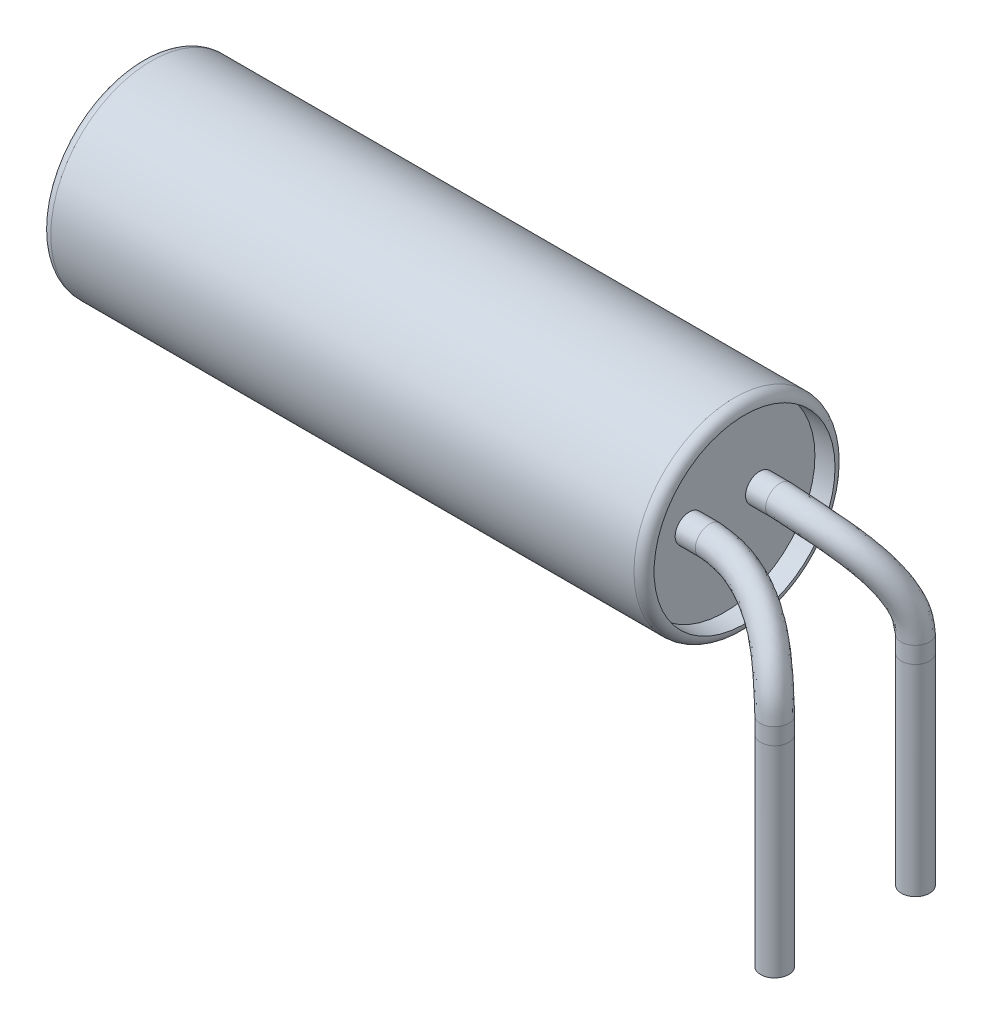
ISO-10303-21;
HEADER;
FILE_DESCRIPTION(('STEP AP214'),'2;1');
FILE_NAME('part.step','',(''),(''),'','','');
FILE_SCHEMA(('AUTOMOTIVE_DESIGN { 1 0 10303 214 1 1 1 1 }'));
ENDSEC;
DATA;
#1=APPLICATION_CONTEXT('core data for automotive mechanical design processes');
#2=APPLICATION_PROTOCOL_DEFINITION('international standard','automotive_design',2000,#1);
#3=PRODUCT_CONTEXT('',#1,'mechanical');
#4=PRODUCT('Part','Part','',(#3));
#5=PRODUCT_RELATED_PRODUCT_CATEGORY('part','',(#4));
#6=PRODUCT_DEFINITION_FORMATION('','',#4);
#7=PRODUCT_DEFINITION_CONTEXT('part definition',#1,'design');
#8=PRODUCT_DEFINITION('design','',#6,#7);
#9=PRODUCT_DEFINITION_SHAPE('','',#8);
#10=(LENGTH_UNIT() NAMED_UNIT(*) SI_UNIT(.MILLI.,.METRE.));
#11=(NAMED_UNIT(*) PLANE_ANGLE_UNIT() SI_UNIT($,.RADIAN.));
#12=(NAMED_UNIT(*) SI_UNIT($,.STERADIAN.) SOLID_ANGLE_UNIT());
#13=UNCERTAINTY_MEASURE_WITH_UNIT(LENGTH_MEASURE(1.E-05),#10,'distance_accuracy_value','');
#14=(GEOMETRIC_REPRESENTATION_CONTEXT(3) GLOBAL_UNCERTAINTY_ASSIGNED_CONTEXT((#13)) GLOBAL_UNIT_ASSIGNED_CONTEXT((#10,
#11,#12)) REPRESENTATION_CONTEXT('',''));
#15=CARTESIAN_POINT('',(0.,0.,0.));
#16=DIRECTION('',(0.,0.,1.));
#17=DIRECTION('',(1.,0.,0.));
#18=AXIS2_PLACEMENT_3D('',#15,#16,#17);
#19=CARTESIAN_POINT('',(0.984259932692,-3.,0.839112365666));
#20=DIRECTION('',(0.,1.,0.));
#21=DIRECTION('',(0.,0.,1.));
#22=AXIS2_PLACEMENT_3D('',#19,#20,#21);
#23=PLANE('',#22);
#24=CARTESIAN_POINT('',(1.,-3.,0.7));
#25=DIRECTION('',(0.,-1.,0.));
#26=DIRECTION('',(0.,0.,-1.));
#27=AXIS2_PLACEMENT_3D('',#24,#25,#26);
#28=CIRCLE('',#27,0.14);
#29=CARTESIAN_POINT('',(1.,-3.,0.56));
#30=VERTEX_POINT('',#29);
#31=EDGE_CURVE('E166',#30,#30,#28,.F.);
#32=ORIENTED_EDGE('',*,*,#31,.F.);
#33=EDGE_LOOP('',(#32));
#34=FACE_BOUND('',#33,.T.);
#35=ADVANCED_FACE('F24',(#34),#23,.F.);
#36=CARTESIAN_POINT('',(0.984259932692,-3.,-0.839112365666));
#37=DIRECTION('',(0.,-1.,0.));
#38=DIRECTION('',(0.,0.,-1.));
#39=AXIS2_PLACEMENT_3D('',#36,#37,#38);
#40=PLANE('',#39);
#41=CARTESIAN_POINT('',(1.,-3.,-0.7));
#42=DIRECTION('',(0.,-1.,0.));
#43=DIRECTION('',(0.,0.,-1.));
#44=AXIS2_PLACEMENT_3D('',#41,#42,#43);
#45=CIRCLE('',#44,0.14);
#46=CARTESIAN_POINT('',(1.,-3.,-0.84));
#47=VERTEX_POINT('',#46);
#48=EDGE_CURVE('E153',#47,#47,#45,.F.);
#49=ORIENTED_EDGE('',*,*,#48,.F.);
#50=EDGE_LOOP('',(#49));
#51=FACE_BOUND('',#50,.T.);
#52=ADVANCED_FACE('F348',(#51),#40,.T.);
#53=CARTESIAN_POINT('',(1.,-1.,0.7));
#54=DIRECTION('',(0.,-1.,0.));
#55=DIRECTION('',(0.,0.,-1.));
#56=AXIS2_PLACEMENT_3D('',#53,#54,#55);
#57=CYLINDRICAL_SURFACE('',#56,0.14);
#58=ORIENTED_EDGE('',*,*,#31,.T.);
#59=EDGE_LOOP('',(#58));
#60=FACE_BOUND('',#59,.T.);
#61=CARTESIAN_POINT('',(1.,-1.,0.7));
#62=DIRECTION('',(0.,1.,0.));
#63=DIRECTION('',(0.,0.,1.));
#64=AXIS2_PLACEMENT_3D('',#61,#62,#63);
#65=CIRCLE('',#64,0.140000000000183);
#66=CARTESIAN_POINT('',(1.,-1.,0.840000000000183));
#67=VERTEX_POINT('',#66);
#68=EDGE_CURVE('E81',#67,#67,#65,.T.);
#69=ORIENTED_EDGE('',*,*,#68,.F.);
#70=EDGE_LOOP('',(#69));
#71=FACE_BOUND('',#70,.T.);
#72=ADVANCED_FACE('F339',(#60,#71),#57,.T.);
#73=CARTESIAN_POINT('',(1.,-1.,-0.7));
#74=DIRECTION('',(0.,-1.,0.));
#75=DIRECTION('',(0.,0.,-1.));
#76=AXIS2_PLACEMENT_3D('',#73,#74,#75);
#77=CYLINDRICAL_SURFACE('',#76,0.14);
#78=ORIENTED_EDGE('',*,*,#48,.T.);
#79=EDGE_LOOP('',(#78));
#80=FACE_BOUND('',#79,.T.);
#81=CARTESIAN_POINT('',(1.,-1.,-0.7));
#82=DIRECTION('',(0.,-1.,0.));
#83=DIRECTION('',(0.,0.,-1.));
#84=AXIS2_PLACEMENT_3D('',#81,#82,#83);
#85=CIRCLE('',#84,0.140000000000183);
#86=CARTESIAN_POINT('',(1.,-1.,-0.840000000000183));
#87=VERTEX_POINT('',#86);
#88=EDGE_CURVE('E144',#87,#87,#85,.T.);
#89=ORIENTED_EDGE('',*,*,#88,.T.);
#90=EDGE_LOOP('',(#89));
#91=FACE_BOUND('',#90,.T.);
#92=ADVANCED_FACE('F337',(#80,#91),#77,.T.);
#93=CARTESIAN_POINT('',(1.015740067308,-0.836117983914,0.560887634334));
#94=CARTESIAN_POINT('',(1.015740067308,-1.,0.560887634334));
#95=CARTESIAN_POINT('',(1.29396479864,-0.830753280627,0.59236776895));
#96=CARTESIAN_POINT('',(1.29396479864,-1.,0.59236776895));
#97=CARTESIAN_POINT('',(1.262484664024,-0.833136319422,0.870592500282));
#98=CARTESIAN_POINT('',(1.262484664024,-1.,0.870592500282));
#99=CARTESIAN_POINT('',(0.984259932692,-0.838501022708,0.839112365666));
#100=CARTESIAN_POINT('',(0.984259932692,-1.,0.839112365666));
#101=CARTESIAN_POINT('',(0.70603520136,-0.843865725994,0.80763223105));
#102=CARTESIAN_POINT('',(0.70603520136,-1.,0.80763223105));
#103=CARTESIAN_POINT('',(0.737515335976,-0.8414826872,0.529407499718));
#104=CARTESIAN_POINT('',(0.737515335976,-1.,0.529407499718));
#105=CARTESIAN_POINT('',(1.015740067308,-0.836117983914,0.560887634334));
#106=CARTESIAN_POINT('',(1.015740067308,-1.,0.560887634334));
#107=(BOUNDED_SURFACE() B_SPLINE_SURFACE(3,1,((#93,#94),(#95,#96),(#97,#98),(#99,#100),(#101,
#102),(#103,#104),(#105,#106)),.UNSPECIFIED.,.T.,.F.,.F.) B_SPLINE_SURFACE_WITH_KNOTS((4,3,4),
(2,2),(0.,0.5,1.),(0.,1.),
.UNSPECIFIED.) GEOMETRIC_REPRESENTATION_ITEM() RATIONAL_B_SPLINE_SURFACE(((1.,1.),
(0.333333333333,0.333333333333),(0.333333333333,0.333333333333),(1.,1.),(0.333333333333,
0.333333333333),(0.333333333333,0.333333333333),(1.,1.))) REPRESENTATION_ITEM('') SURFACE());
#108=CARTESIAN_POINT('',(1.015740067308,-0.836117983914,0.560887634334));
#109=CARTESIAN_POINT('',(0.737515335976,-0.8414826872,0.529407499718));
#110=CARTESIAN_POINT('',(0.70603520136,-0.843865725994,0.80763223105));
#111=CARTESIAN_POINT('',(0.984259932692,-0.838501022708,0.839112365666));
#112=CARTESIAN_POINT('',(1.262484664024,-0.833136319422,0.870592500282));
#113=CARTESIAN_POINT('',(1.29396479864,-0.830753280627,0.59236776895));
#114=CARTESIAN_POINT('',(1.015740067308,-0.836117983914,0.560887634334));
#115=(BOUNDED_CURVE() B_SPLINE_CURVE(3,(#108,#109,#110,#111,#112,#113,#114),.UNSPECIFIED.,.T.,
.F.) B_SPLINE_CURVE_WITH_KNOTS((4,3,4),(0.,0.5,1.),
.UNSPECIFIED.) CURVE() GEOMETRIC_REPRESENTATION_ITEM() RATIONAL_B_SPLINE_CURVE((1.,
0.333333333333,0.333333333333,1.,0.333333333333,0.333333333333,1.)) REPRESENTATION_ITEM(''));
#116=CARTESIAN_POINT('',(1.015740067308,-0.836117983914,0.560887634334));
#117=VERTEX_POINT('',#116);
#118=EDGE_CURVE('E133',#117,#117,#115,.F.);
#119=ORIENTED_EDGE('',*,*,#68,.T.);
#120=EDGE_LOOP('',(#119));
#121=FACE_BOUND('',#120,.T.);
#122=ORIENTED_EDGE('',*,*,#118,.T.);
#123=EDGE_LOOP('',(#122));
#124=FACE_BOUND('',#123,.T.);
#125=ADVANCED_FACE('F334',(#121,#124),#107,.T.);
#126=CARTESIAN_POINT('',(1.015740067308,-0.836117983914,-0.560887634334));
#127=CARTESIAN_POINT('',(1.015740067308,-1.,-0.560887634334));
#128=CARTESIAN_POINT('',(1.29396479864,-0.830753280627,-0.59236776895));
#129=CARTESIAN_POINT('',(1.29396479864,-1.,-0.59236776895));
#130=CARTESIAN_POINT('',(1.262484664024,-0.833136319422,-0.870592500282));
#131=CARTESIAN_POINT('',(1.262484664024,-1.,-0.870592500282));
#132=CARTESIAN_POINT('',(0.984259932692,-0.838501022708,-0.839112365666));
#133=CARTESIAN_POINT('',(0.984259932692,-1.,-0.839112365666));
#134=CARTESIAN_POINT('',(0.70603520136,-0.843865725994,-0.80763223105));
#135=CARTESIAN_POINT('',(0.70603520136,-1.,-0.80763223105));
#136=CARTESIAN_POINT('',(0.737515335976,-0.8414826872,-0.529407499718));
#137=CARTESIAN_POINT('',(0.737515335976,-1.,-0.529407499718));
#138=CARTESIAN_POINT('',(1.015740067308,-0.836117983914,-0.560887634334));
#139=CARTESIAN_POINT('',(1.015740067308,-1.,-0.560887634334));
#140=(BOUNDED_SURFACE() B_SPLINE_SURFACE(3,1,((#126,#127),(#128,#129),(#130,#131),(#132,#133),
(#134,#135),(#136,#137),(#138,#139)),.UNSPECIFIED.,.T.,.F.,.F.) B_SPLINE_SURFACE_WITH_KNOTS((4,
3,4),(2,2),(0.,0.5,1.),(0.,1.),
.UNSPECIFIED.) GEOMETRIC_REPRESENTATION_ITEM() RATIONAL_B_SPLINE_SURFACE(((1.,1.),
(0.333333333333,0.333333333333),(0.333333333333,0.333333333333),(1.,1.),(0.333333333333,
0.333333333333),(0.333333333333,0.333333333333),(1.,1.))) REPRESENTATION_ITEM('') SURFACE());
#141=CARTESIAN_POINT('',(1.015740067308,-0.836117983914,-0.560887634334));
#142=CARTESIAN_POINT('',(0.737515335976,-0.8414826872,-0.529407499718));
#143=CARTESIAN_POINT('',(0.70603520136,-0.843865725994,-0.80763223105));
#144=CARTESIAN_POINT('',(0.984259932692,-0.838501022708,-0.839112365666));
#145=CARTESIAN_POINT('',(1.262484664024,-0.833136319422,-0.870592500282));
#146=CARTESIAN_POINT('',(1.29396479864,-0.830753280627,-0.59236776895));
#147=CARTESIAN_POINT('',(1.015740067308,-0.836117983914,-0.560887634334));
#148=(BOUNDED_CURVE() B_SPLINE_CURVE(3,(#141,#142,#143,#144,#145,#146,#147),.UNSPECIFIED.,.T.,
.F.) B_SPLINE_CURVE_WITH_KNOTS((4,3,4),(0.,0.5,1.),
.UNSPECIFIED.) CURVE() GEOMETRIC_REPRESENTATION_ITEM() RATIONAL_B_SPLINE_CURVE((1.,
0.333333333333,0.333333333333,1.,0.333333333333,0.333333333333,1.)) REPRESENTATION_ITEM(''));
#149=CARTESIAN_POINT('',(1.015740067308,-0.836117983914,-0.560887634334));
#150=VERTEX_POINT('',#149);
#151=EDGE_CURVE('E143',#150,#150,#148,.F.);
#152=ORIENTED_EDGE('',*,*,#151,.F.);
#153=EDGE_LOOP('',(#152));
#154=FACE_BOUND('',#153,.T.);
#155=ORIENTED_EDGE('',*,*,#88,.F.);
#156=EDGE_LOOP('',(#155));
#157=FACE_BOUND('',#156,.T.);
#158=ADVANCED_FACE('F108',(#154,#157),#140,.F.);
#159=CARTESIAN_POINT('',(-0.004086019351866,-0.139807884508,0.342668190572));
#160=CARTESIAN_POINT('',(0.05819825144663,-0.145525224415,0.341603108665));
#161=CARTESIAN_POINT('',(0.17788976835,-0.156512221249,0.339556343608));
#162=CARTESIAN_POINT('',(0.338471592077,-0.196879700007,0.356045557664));
#163=CARTESIAN_POINT('',(0.476756786135,-0.24773201586,0.378389397387));
#164=CARTESIAN_POINT('',(0.599908520349,-0.307654935133,0.40448620936));
#165=CARTESIAN_POINT('',(0.714729572021,-0.377846023481,0.435188476897));
#166=CARTESIAN_POINT('',(0.822321102422,-0.464105061271,0.473298903905));
#167=CARTESIAN_POINT('',(0.914509937698,-0.570567597818,0.514596653534));
#168=CARTESIAN_POINT('',(0.984985485343,-0.695886247708,0.551949989724));
#169=CARTESIAN_POINT('',(1.005615909484,-0.78995483883,0.557945434544));
#170=CARTESIAN_POINT('',(1.015740067308,-0.836117983914,0.560887634334));
#171=CARTESIAN_POINT('',(-0.004086019351866,-0.154471503363,0.622283959587));
#172=CARTESIAN_POINT('',(0.05693907429329,-0.166815766671,0.621187107161));
#173=CARTESIAN_POINT('',(0.174210833823,-0.19053770451,0.61907928878));
#174=CARTESIAN_POINT('',(0.317747533271,-0.260920510606,0.635470090962));
#175=CARTESIAN_POINT('',(0.420233943328,-0.343560783099,0.648374270391));
#176=CARTESIAN_POINT('',(0.48604972466,-0.426603766097,0.644805695956));
#177=CARTESIAN_POINT('',(0.533224419481,-0.499034205378,0.620861114569));
#178=CARTESIAN_POINT('',(0.583810128099,-0.564933586169,0.589662755636));
#179=CARTESIAN_POINT('',(0.64346722846,-0.63843801051,0.565678306959));
#180=CARTESIAN_POINT('',(0.703983705624,-0.729294814321,0.552921647954));
#181=CARTESIAN_POINT('',(0.726476996448,-0.804551353449,0.537148165746));
#182=CARTESIAN_POINT('',(0.737515335976,-0.8414826872,0.529407499718));
#183=CARTESIAN_POINT('',(0.004086019351866,0.125144265652,0.636947578443));
#184=CARTESIAN_POINT('',(0.07911078540651,0.111399457469,0.642292291019));
#185=CARTESIAN_POINT('',(0.223285678028,0.08498609627955,0.652563210907));
#186=CARTESIAN_POINT('',(0.416677597022,-0.004586846011312,0.705607086775));
#187=CARTESIAN_POINT('',(0.564730364908,-0.124656906383,0.771027268937));
#188=CARTESIAN_POINT('',(0.657001161997,-0.264296546034,0.831105295757));
#189=CARTESIAN_POINT('',(0.69580365222,-0.401107292923,0.865182689189));
#190=CARTESIAN_POINT('',(0.703694123419,-0.521377423657,0.869507810704));
#191=CARTESIAN_POINT('',(0.704665617767,-0.628124077423,0.855604675921));
#192=CARTESIAN_POINT('',(0.708865294625,-0.732480695681,0.836712682121));
#193=CARTESIAN_POINT('',(0.706966845006,-0.807198681475,0.817205278622));
#194=CARTESIAN_POINT('',(0.70603520136,-0.843865725994,0.80763223105));
#195=CARTESIAN_POINT('',(0.004086019351866,0.139807884508,0.357331809428));
#196=CARTESIAN_POINT('',(0.08036996255985,0.132689999725,0.362708292524));
#197=CARTESIAN_POINT('',(0.226964612555,0.119011579541,0.373040265735));
#198=CARTESIAN_POINT('',(0.437401655827,0.05945396458789,0.426182553477));
#199=CARTESIAN_POINT('',(0.621253207716,-0.02882813914385,0.501042395934));
#200=CARTESIAN_POINT('',(0.770859957686,-0.14534771507,0.59078580916));
#201=CARTESIAN_POINT('',(0.87730880476,-0.279919111027,0.679510051517));
#202=CARTESIAN_POINT('',(0.942205097741,-0.42054889876,0.753143958973));
#203=CARTESIAN_POINT('',(0.975708327005,-0.560253664732,0.804523022496));
#204=CARTESIAN_POINT('',(0.989867074345,-0.699072129067,0.835741023892));
#205=CARTESIAN_POINT('',(0.986105758042,-0.792602166856,0.83800254742));
#206=CARTESIAN_POINT('',(0.984259932692,-0.838501022708,0.839112365666));
#207=CARTESIAN_POINT('',(0.004086019351866,0.154471503363,0.07771604041254));
#208=CARTESIAN_POINT('',(0.08162913971319,0.153980541981,0.0831242940287));
#209=CARTESIAN_POINT('',(0.230643547082,0.153037062802,0.09351732056359));
#210=CARTESIAN_POINT('',(0.458125714632,0.123494775187,0.146758020179));
#211=CARTESIAN_POINT('',(0.677776050524,0.06700062809576,0.23105752293));
#212=CARTESIAN_POINT('',(0.884718753376,-0.02639888410568,0.350466322564));
#213=CARTESIAN_POINT('',(1.0588139573,-0.15873092913,0.493837413846));
#214=CARTESIAN_POINT('',(1.180716072064,-0.319720373862,0.636780107242));
#215=CARTESIAN_POINT('',(1.246751036242,-0.49238325204,0.75344136907));
#216=CARTESIAN_POINT('',(1.270868854064,-0.665663562454,0.834769365663));
#217=CARTESIAN_POINT('',(1.265244671078,-0.778005652237,0.858799816218));
#218=CARTESIAN_POINT('',(1.262484664024,-0.833136319422,0.870592500282));
#219=CARTESIAN_POINT('',(-0.004086019351866,-0.125144265652,0.06305242155674));
#220=CARTESIAN_POINT('',(0.05945742859996,-0.124234682159,0.06201911016995));
#221=CARTESIAN_POINT('',(0.181568702877,-0.122486737988,0.06003339843675));
#222=CARTESIAN_POINT('',(0.359195650882,-0.132838889407,0.07662102436548));
#223=CARTESIAN_POINT('',(0.533279628943,-0.15190324862,0.108404524384));
#224=CARTESIAN_POINT('',(0.713767316039,-0.188706104169,0.164166722764));
#225=CARTESIAN_POINT('',(0.896234724561,-0.256657841585,0.249515839225));
#226=CARTESIAN_POINT('',(1.060832076744,-0.363276536374,0.356935052174));
#227=CARTESIAN_POINT('',(1.185552646935,-0.502697185127,0.463515000109));
#228=CARTESIAN_POINT('',(1.265987265062,-0.662477681095,0.550978331495));
#229=CARTESIAN_POINT('',(1.28475482252,-0.775358324211,0.578742703342));
#230=CARTESIAN_POINT('',(1.29396479864,-0.830753280627,0.59236776895));
#231=CARTESIAN_POINT('',(-0.004086019351866,-0.139807884508,0.342668190572));
#232=CARTESIAN_POINT('',(0.05819825144663,-0.145525224415,0.341603108665));
#233=CARTESIAN_POINT('',(0.17788976835,-0.156512221249,0.339556343608));
#234=CARTESIAN_POINT('',(0.338471592077,-0.196879700007,0.356045557664));
#235=CARTESIAN_POINT('',(0.476756786135,-0.24773201586,0.378389397387));
#236=CARTESIAN_POINT('',(0.599908520349,-0.307654935133,0.40448620936));
#237=CARTESIAN_POINT('',(0.714729572021,-0.377846023481,0.435188476897));
#238=CARTESIAN_POINT('',(0.822321102422,-0.464105061271,0.473298903905));
#239=CARTESIAN_POINT('',(0.914509937698,-0.570567597818,0.514596653534));
#240=CARTESIAN_POINT('',(0.984985485343,-0.695886247708,0.551949989724));
#241=CARTESIAN_POINT('',(1.005615909484,-0.78995483883,0.557945434544));
#242=CARTESIAN_POINT('',(1.015740067308,-0.836117983914,0.560887634334));
#243=(BOUNDED_SURFACE() B_SPLINE_SURFACE(3,3,((#159,#160,#161,#162,#163,#164,#165,#166,#167,
#168,#169,#170),(#171,#172,#173,#174,#175,#176,#177,#178,#179,#180,#181,#182),(#183,#184,#185,
#186,#187,#188,#189,#190,#191,#192,#193,#194),(#195,#196,#197,#198,#199,#200,#201,#202,#203,
#204,#205,#206),(#207,#208,#209,#210,#211,#212,#213,#214,#215,#216,#217,#218),(#219,#220,#221,
#222,#223,#224,#225,#226,#227,#228,#229,#230),(#231,#232,#233,#234,#235,#236,#237,#238,#239,
#240,#241,#242)),.UNSPECIFIED.,.T.,.F.,.F.) B_SPLINE_SURFACE_WITH_KNOTS((4,3,4),(4,1,1,1,1,1,1,
1,1,4),(0.,0.5,1.),(0.,0.135509410904,0.260408073144,0.378167695071,0.491536258805,
0.602277347645,0.708346818729,0.810115947657,0.906816452199,1.),
.UNSPECIFIED.) GEOMETRIC_REPRESENTATION_ITEM() RATIONAL_B_SPLINE_SURFACE(((1.,1.,1.,1.,1.,1.,1.,
1.,1.,1.,1.,1.),(0.333333333333,0.333333333333,0.333333333333,0.333333333333,0.333333333333,
0.333333333333,0.333333333333,0.333333333333,0.333333333333,0.333333333333,0.333333333333,
0.333333333333),(0.333333333333,0.333333333333,0.333333333333,0.333333333333,0.333333333333,
0.333333333333,0.333333333333,0.333333333333,0.333333333333,0.333333333333,0.333333333333,
0.333333333333),(1.,1.,1.,1.,1.,1.,1.,1.,1.,1.,1.,1.),(0.333333333333,0.333333333333,
0.333333333333,0.333333333333,0.333333333333,0.333333333333,0.333333333333,0.333333333333,
0.333333333333,0.333333333333,0.333333333333,0.333333333333),(0.333333333333,0.333333333333,
0.333333333333,0.333333333333,0.333333333333,0.333333333333,0.333333333333,0.333333333333,
0.333333333333,0.333333333333,0.333333333333,0.333333333333),(1.,1.,1.,1.,1.,1.,1.,1.,1.,1.,1.,1.))) REPRESENTATION_ITEM('') SURFACE());
#244=CARTESIAN_POINT('',(-0.004086019351866,-0.139807884508,0.342668190572));
#245=CARTESIAN_POINT('',(-0.004086019351866,-0.125144265652,0.06305242155674));
#246=CARTESIAN_POINT('',(0.004086019351866,0.154471503363,0.07771604041254));
#247=CARTESIAN_POINT('',(0.004086019351866,0.139807884508,0.357331809428));
#248=CARTESIAN_POINT('',(0.004086019351866,0.125144265652,0.636947578443));
#249=CARTESIAN_POINT('',(-0.004086019351866,-0.154471503363,0.622283959587));
#250=CARTESIAN_POINT('',(-0.004086019351866,-0.139807884508,0.342668190572));
#251=(BOUNDED_CURVE() B_SPLINE_CURVE(3,(#244,#245,#246,#247,#248,#249,#250),.UNSPECIFIED.,.T.,
.F.) B_SPLINE_CURVE_WITH_KNOTS((4,3,4),(0.,0.5,1.),
.UNSPECIFIED.) CURVE() GEOMETRIC_REPRESENTATION_ITEM() RATIONAL_B_SPLINE_CURVE((1.,
0.333333333333,0.333333333333,1.,0.333333333333,0.333333333333,1.)) REPRESENTATION_ITEM(''));
#252=CARTESIAN_POINT('',(0.00408601935186601,0.13980788450787,0.357331809427993));
#253=VERTEX_POINT('',#252);
#254=CARTESIAN_POINT('',(-0.000213985108614678,0.,0.210000000000027));
#255=VERTEX_POINT('',#254);
#256=EDGE_CURVE('E86',#253,#255,#251,.F.);
#257=CARTESIAN_POINT('',(-0.004086019351866,-0.139807884508,0.342668190572));
#258=CARTESIAN_POINT('',(-0.004086019351866,-0.125144265652,0.06305242155674));
#259=CARTESIAN_POINT('',(0.004086019351866,0.154471503363,0.07771604041254));
#260=CARTESIAN_POINT('',(0.004086019351866,0.139807884508,0.357331809428));
#261=CARTESIAN_POINT('',(0.004086019351866,0.125144265652,0.636947578443));
#262=CARTESIAN_POINT('',(-0.004086019351866,-0.154471503363,0.622283959587));
#263=CARTESIAN_POINT('',(-0.004086019351866,-0.139807884508,0.342668190572));
#264=(BOUNDED_CURVE() B_SPLINE_CURVE(3,(#257,#258,#259,#260,#261,#262,#263),.UNSPECIFIED.,.T.,
.F.) B_SPLINE_CURVE_WITH_KNOTS((4,3,4),(0.,0.5,1.),
.UNSPECIFIED.) CURVE() GEOMETRIC_REPRESENTATION_ITEM() RATIONAL_B_SPLINE_CURVE((1.,
0.333333333333,0.333333333333,1.,0.333333333333,0.333333333333,1.)) REPRESENTATION_ITEM(''));
#265=CARTESIAN_POINT('',(0.000213985108616736,0.,0.489999999999902));
#266=VERTEX_POINT('',#265);
#267=EDGE_CURVE('E75',#266,#253,#264,.F.);
#268=CARTESIAN_POINT('',(-0.004086019351866,-0.139807884508,0.342668190572));
#269=CARTESIAN_POINT('',(-0.004086019351866,-0.125144265652,0.06305242155674));
#270=CARTESIAN_POINT('',(0.004086019351866,0.154471503363,0.07771604041254));
#271=CARTESIAN_POINT('',(0.004086019351866,0.139807884508,0.357331809428));
#272=CARTESIAN_POINT('',(0.004086019351866,0.125144265652,0.636947578443));
#273=CARTESIAN_POINT('',(-0.004086019351866,-0.154471503363,0.622283959587));
#274=CARTESIAN_POINT('',(-0.004086019351866,-0.139807884508,0.342668190572));
#275=(BOUNDED_CURVE() B_SPLINE_CURVE(3,(#268,#269,#270,#271,#272,#273,#274),.UNSPECIFIED.,.T.,
.F.) B_SPLINE_CURVE_WITH_KNOTS((4,3,4),(0.,0.5,1.),
.UNSPECIFIED.) CURVE() GEOMETRIC_REPRESENTATION_ITEM() RATIONAL_B_SPLINE_CURVE((1.,
0.333333333333,0.333333333333,1.,0.333333333333,0.333333333333,1.)) REPRESENTATION_ITEM(''));
#276=CARTESIAN_POINT('',(-0.00408601935186601,-0.13980788450787,0.342668190572007));
#277=VERTEX_POINT('',#276);
#278=EDGE_CURVE('E70',#277,#266,#275,.F.);
#279=CARTESIAN_POINT('',(-0.004086019351866,-0.139807884508,0.342668190572));
#280=CARTESIAN_POINT('',(-0.004086019351866,-0.125144265652,0.06305242155674));
#281=CARTESIAN_POINT('',(0.004086019351866,0.154471503363,0.07771604041254));
#282=CARTESIAN_POINT('',(0.004086019351866,0.139807884508,0.357331809428));
#283=CARTESIAN_POINT('',(0.004086019351866,0.125144265652,0.636947578443));
#284=CARTESIAN_POINT('',(-0.004086019351866,-0.154471503363,0.622283959587));
#285=CARTESIAN_POINT('',(-0.004086019351866,-0.139807884508,0.342668190572));
#286=(BOUNDED_CURVE() B_SPLINE_CURVE(3,(#279,#280,#281,#282,#283,#284,#285),.UNSPECIFIED.,.T.,
.F.) B_SPLINE_CURVE_WITH_KNOTS((4,3,4),(0.,0.5,1.),
.UNSPECIFIED.) CURVE() GEOMETRIC_REPRESENTATION_ITEM() RATIONAL_B_SPLINE_CURVE((1.,
0.333333333333,0.333333333333,1.,0.333333333333,0.333333333333,1.)) REPRESENTATION_ITEM(''));
#287=EDGE_CURVE('E78',#255,#277,#286,.F.);
#288=ORIENTED_EDGE('',*,*,#118,.F.);
#289=EDGE_LOOP('',(#288));
#290=FACE_BOUND('',#289,.T.);
#291=ORIENTED_EDGE('',*,*,#256,.F.);
#292=ORIENTED_EDGE('',*,*,#267,.F.);
#293=ORIENTED_EDGE('',*,*,#278,.F.);
#294=ORIENTED_EDGE('',*,*,#287,.F.);
#295=EDGE_LOOP('',(#291,#292,#293,#294));
#296=FACE_BOUND('',#295,.T.);
#297=ADVANCED_FACE('F85',(#290,#296),#243,.F.);
#298=CARTESIAN_POINT('',(-0.004086019351866,-0.139807884508,-0.342668190572));
#299=CARTESIAN_POINT('',(0.05819825144663,-0.145525224415,-0.341603108665));
#300=CARTESIAN_POINT('',(0.17788976835,-0.156512221249,-0.339556343608));
#301=CARTESIAN_POINT('',(0.338471592077,-0.196879700007,-0.356045557664));
#302=CARTESIAN_POINT('',(0.476756786135,-0.24773201586,-0.378389397387));
#303=CARTESIAN_POINT('',(0.599908520349,-0.307654935133,-0.40448620936));
#304=CARTESIAN_POINT('',(0.714729572021,-0.377846023481,-0.435188476897));
#305=CARTESIAN_POINT('',(0.822321102422,-0.464105061271,-0.473298903905));
#306=CARTESIAN_POINT('',(0.914509937698,-0.570567597818,-0.514596653534));
#307=CARTESIAN_POINT('',(0.984985485343,-0.695886247708,-0.551949989724));
#308=CARTESIAN_POINT('',(1.005615909484,-0.78995483883,-0.557945434544));
#309=CARTESIAN_POINT('',(1.015740067308,-0.836117983914,-0.560887634334));
#310=CARTESIAN_POINT('',(-0.004086019351866,-0.154471503363,-0.622283959587));
#311=CARTESIAN_POINT('',(0.05693907429329,-0.166815766671,-0.621187107161));
#312=CARTESIAN_POINT('',(0.174210833823,-0.19053770451,-0.61907928878));
#313=CARTESIAN_POINT('',(0.317747533271,-0.260920510606,-0.635470090962));
#314=CARTESIAN_POINT('',(0.420233943328,-0.343560783099,-0.648374270391));
#315=CARTESIAN_POINT('',(0.48604972466,-0.426603766097,-0.644805695956));
#316=CARTESIAN_POINT('',(0.533224419481,-0.499034205378,-0.620861114569));
#317=CARTESIAN_POINT('',(0.583810128099,-0.564933586169,-0.589662755636));
#318=CARTESIAN_POINT('',(0.64346722846,-0.63843801051,-0.565678306959));
#319=CARTESIAN_POINT('',(0.703983705624,-0.729294814321,-0.552921647954));
#320=CARTESIAN_POINT('',(0.726476996448,-0.804551353449,-0.537148165746));
#321=CARTESIAN_POINT('',(0.737515335976,-0.8414826872,-0.529407499718));
#322=CARTESIAN_POINT('',(0.004086019351866,0.125144265652,-0.636947578443));
#323=CARTESIAN_POINT('',(0.07911078540651,0.111399457469,-0.642292291019));
#324=CARTESIAN_POINT('',(0.223285678028,0.08498609627955,-0.652563210907));
#325=CARTESIAN_POINT('',(0.416677597022,-0.004586846011312,-0.705607086775));
#326=CARTESIAN_POINT('',(0.564730364908,-0.124656906383,-0.771027268937));
#327=CARTESIAN_POINT('',(0.657001161997,-0.264296546034,-0.831105295757));
#328=CARTESIAN_POINT('',(0.69580365222,-0.401107292923,-0.865182689189));
#329=CARTESIAN_POINT('',(0.703694123419,-0.521377423657,-0.869507810704));
#330=CARTESIAN_POINT('',(0.704665617767,-0.628124077423,-0.855604675921));
#331=CARTESIAN_POINT('',(0.708865294625,-0.732480695681,-0.836712682121));
#332=CARTESIAN_POINT('',(0.706966845006,-0.807198681475,-0.817205278622));
#333=CARTESIAN_POINT('',(0.70603520136,-0.843865725994,-0.80763223105));
#334=CARTESIAN_POINT('',(0.004086019351866,0.139807884508,-0.357331809428));
#335=CARTESIAN_POINT('',(0.08036996255985,0.132689999725,-0.362708292524));
#336=CARTESIAN_POINT('',(0.226964612555,0.119011579541,-0.373040265735));
#337=CARTESIAN_POINT('',(0.437401655827,0.05945396458789,-0.426182553477));
#338=CARTESIAN_POINT('',(0.621253207716,-0.02882813914385,-0.501042395934));
#339=CARTESIAN_POINT('',(0.770859957686,-0.14534771507,-0.59078580916));
#340=CARTESIAN_POINT('',(0.87730880476,-0.279919111027,-0.679510051517));
#341=CARTESIAN_POINT('',(0.942205097741,-0.42054889876,-0.753143958973));
#342=CARTESIAN_POINT('',(0.975708327005,-0.560253664732,-0.804523022496));
#343=CARTESIAN_POINT('',(0.989867074345,-0.699072129067,-0.835741023892));
#344=CARTESIAN_POINT('',(0.986105758042,-0.792602166856,-0.83800254742));
#345=CARTESIAN_POINT('',(0.984259932692,-0.838501022708,-0.839112365666));
#346=CARTESIAN_POINT('',(0.004086019351866,0.154471503363,-0.07771604041254));
#347=CARTESIAN_POINT('',(0.08162913971319,0.153980541981,-0.0831242940287));
#348=CARTESIAN_POINT('',(0.230643547082,0.153037062802,-0.09351732056359));
#349=CARTESIAN_POINT('',(0.458125714632,0.123494775187,-0.146758020179));
#350=CARTESIAN_POINT('',(0.677776050524,0.06700062809576,-0.23105752293));
#351=CARTESIAN_POINT('',(0.884718753376,-0.02639888410568,-0.350466322564));
#352=CARTESIAN_POINT('',(1.0588139573,-0.15873092913,-0.493837413846));
#353=CARTESIAN_POINT('',(1.180716072064,-0.319720373862,-0.636780107242));
#354=CARTESIAN_POINT('',(1.246751036242,-0.49238325204,-0.75344136907));
#355=CARTESIAN_POINT('',(1.270868854064,-0.665663562454,-0.834769365663));
#356=CARTESIAN_POINT('',(1.265244671078,-0.778005652237,-0.858799816218));
#357=CARTESIAN_POINT('',(1.262484664024,-0.833136319422,-0.870592500282));
#358=CARTESIAN_POINT('',(-0.004086019351866,-0.125144265652,-0.06305242155674));
#359=CARTESIAN_POINT('',(0.05945742859996,-0.124234682159,-0.06201911016995));
#360=CARTESIAN_POINT('',(0.181568702877,-0.122486737988,-0.06003339843675));
#361=CARTESIAN_POINT('',(0.359195650882,-0.132838889407,-0.07662102436548));
#362=CARTESIAN_POINT('',(0.533279628943,-0.15190324862,-0.108404524384));
#363=CARTESIAN_POINT('',(0.713767316039,-0.188706104169,-0.164166722764));
#364=CARTESIAN_POINT('',(0.896234724561,-0.256657841585,-0.249515839225));
#365=CARTESIAN_POINT('',(1.060832076744,-0.363276536374,-0.356935052174));
#366=CARTESIAN_POINT('',(1.185552646935,-0.502697185127,-0.463515000109));
#367=CARTESIAN_POINT('',(1.265987265062,-0.662477681095,-0.550978331495));
#368=CARTESIAN_POINT('',(1.28475482252,-0.775358324211,-0.578742703342));
#369=CARTESIAN_POINT('',(1.29396479864,-0.830753280627,-0.59236776895));
#370=CARTESIAN_POINT('',(-0.004086019351866,-0.139807884508,-0.342668190572));
#371=CARTESIAN_POINT('',(0.05819825144663,-0.145525224415,-0.341603108665));
#372=CARTESIAN_POINT('',(0.17788976835,-0.156512221249,-0.339556343608));
#373=CARTESIAN_POINT('',(0.338471592077,-0.196879700007,-0.356045557664));
#374=CARTESIAN_POINT('',(0.476756786135,-0.24773201586,-0.378389397387));
#375=CARTESIAN_POINT('',(0.599908520349,-0.307654935133,-0.40448620936));
#376=CARTESIAN_POINT('',(0.714729572021,-0.377846023481,-0.435188476897));
#377=CARTESIAN_POINT('',(0.822321102422,-0.464105061271,-0.473298903905));
#378=CARTESIAN_POINT('',(0.914509937698,-0.570567597818,-0.514596653534));
#379=CARTESIAN_POINT('',(0.984985485343,-0.695886247708,-0.551949989724));
#380=CARTESIAN_POINT('',(1.005615909484,-0.78995483883,-0.557945434544));
#381=CARTESIAN_POINT('',(1.015740067308,-0.836117983914,-0.560887634334));
#382=(BOUNDED_SURFACE() B_SPLINE_SURFACE(3,3,((#298,#299,#300,#301,#302,#303,#304,#305,#306,
#307,#308,#309),(#310,#311,#312,#313,#314,#315,#316,#317,#318,#319,#320,#321),(#322,#323,#324,
#325,#326,#327,#328,#329,#330,#331,#332,#333),(#334,#335,#336,#337,#338,#339,#340,#341,#342,
#343,#344,#345),(#346,#347,#348,#349,#350,#351,#352,#353,#354,#355,#356,#357),(#358,#359,#360,
#361,#362,#363,#364,#365,#366,#367,#368,#369),(#370,#371,#372,#373,#374,#375,#376,#377,#378,
#379,#380,#381)),.UNSPECIFIED.,.T.,.F.,.F.) B_SPLINE_SURFACE_WITH_KNOTS((4,3,4),(4,1,1,1,1,1,1,
1,1,4),(0.,0.5,1.),(0.,0.135509410904,0.260408073144,0.378167695071,0.491536258805,
0.602277347645,0.708346818729,0.810115947657,0.906816452199,1.),
.UNSPECIFIED.) GEOMETRIC_REPRESENTATION_ITEM() RATIONAL_B_SPLINE_SURFACE(((1.,1.,1.,1.,1.,1.,1.,
1.,1.,1.,1.,1.),(0.333333333333,0.333333333333,0.333333333333,0.333333333333,0.333333333333,
0.333333333333,0.333333333333,0.333333333333,0.333333333333,0.333333333333,0.333333333333,
0.333333333333),(0.333333333333,0.333333333333,0.333333333333,0.333333333333,0.333333333333,
0.333333333333,0.333333333333,0.333333333333,0.333333333333,0.333333333333,0.333333333333,
0.333333333333),(1.,1.,1.,1.,1.,1.,1.,1.,1.,1.,1.,1.),(0.333333333333,0.333333333333,
0.333333333333,0.333333333333,0.333333333333,0.333333333333,0.333333333333,0.333333333333,
0.333333333333,0.333333333333,0.333333333333,0.333333333333),(0.333333333333,0.333333333333,
0.333333333333,0.333333333333,0.333333333333,0.333333333333,0.333333333333,0.333333333333,
0.333333333333,0.333333333333,0.333333333333,0.333333333333),(1.,1.,1.,1.,1.,1.,1.,1.,1.,1.,1.,1.))) REPRESENTATION_ITEM('') SURFACE());
#383=CARTESIAN_POINT('',(-0.004086019351866,-0.139807884508,-0.342668190572));
#384=CARTESIAN_POINT('',(-0.004086019351866,-0.154471503363,-0.622283959587));
#385=CARTESIAN_POINT('',(0.004086019351866,0.125144265652,-0.636947578443));
#386=CARTESIAN_POINT('',(0.004086019351866,0.139807884508,-0.357331809428));
#387=CARTESIAN_POINT('',(0.004086019351866,0.154471503363,-0.07771604041254));
#388=CARTESIAN_POINT('',(-0.004086019351866,-0.125144265652,-0.06305242155674));
#389=CARTESIAN_POINT('',(-0.004086019351866,-0.139807884508,-0.342668190572));
#390=(BOUNDED_CURVE() B_SPLINE_CURVE(3,(#383,#384,#385,#386,#387,#388,#389),.UNSPECIFIED.,.T.,
.F.) B_SPLINE_CURVE_WITH_KNOTS((4,3,4),(0.,0.5,1.),
.UNSPECIFIED.) CURVE() GEOMETRIC_REPRESENTATION_ITEM() RATIONAL_B_SPLINE_CURVE((1.,
0.333333333333,0.333333333333,1.,0.333333333333,0.333333333333,1.)) REPRESENTATION_ITEM(''));
#391=CARTESIAN_POINT('',(-0.00408601935186601,-0.139807884507734,-0.342668190568997));
#392=VERTEX_POINT('',#391);
#393=CARTESIAN_POINT('',(-0.000213985108614614,0.,-0.210000000000027));
#394=VERTEX_POINT('',#393);
#395=EDGE_CURVE('E270',#392,#394,#390,.F.);
#396=CARTESIAN_POINT('',(-0.004086019351866,-0.139807884508,-0.342668190572));
#397=CARTESIAN_POINT('',(-0.004086019351866,-0.154471503363,-0.622283959587));
#398=CARTESIAN_POINT('',(0.004086019351866,0.125144265652,-0.636947578443));
#399=CARTESIAN_POINT('',(0.004086019351866,0.139807884508,-0.357331809428));
#400=CARTESIAN_POINT('',(0.004086019351866,0.154471503363,-0.07771604041254));
#401=CARTESIAN_POINT('',(-0.004086019351866,-0.125144265652,-0.06305242155674));
#402=CARTESIAN_POINT('',(-0.004086019351866,-0.139807884508,-0.342668190572));
#403=(BOUNDED_CURVE() B_SPLINE_CURVE(3,(#396,#397,#398,#399,#400,#401,#402),.UNSPECIFIED.,.T.,
.F.) B_SPLINE_CURVE_WITH_KNOTS((4,3,4),(0.,0.5,1.),
.UNSPECIFIED.) CURVE() GEOMETRIC_REPRESENTATION_ITEM() RATIONAL_B_SPLINE_CURVE((1.,
0.333333333333,0.333333333333,1.,0.333333333333,0.333333333333,1.)) REPRESENTATION_ITEM(''));
#404=CARTESIAN_POINT('',(0.000213985108616671,0.,-0.489999999999902));
#405=VERTEX_POINT('',#404);
#406=EDGE_CURVE('E150',#392,#405,#403,.T.);
#407=CARTESIAN_POINT('',(-0.004086019351866,-0.139807884508,-0.342668190572));
#408=CARTESIAN_POINT('',(-0.004086019351866,-0.154471503363,-0.622283959587));
#409=CARTESIAN_POINT('',(0.004086019351866,0.125144265652,-0.636947578443));
#410=CARTESIAN_POINT('',(0.004086019351866,0.139807884508,-0.357331809428));
#411=CARTESIAN_POINT('',(0.004086019351866,0.154471503363,-0.07771604041254));
#412=CARTESIAN_POINT('',(-0.004086019351866,-0.125144265652,-0.06305242155674));
#413=CARTESIAN_POINT('',(-0.004086019351866,-0.139807884508,-0.342668190572));
#414=(BOUNDED_CURVE() B_SPLINE_CURVE(3,(#407,#408,#409,#410,#411,#412,#413),.UNSPECIFIED.,.T.,
.F.) B_SPLINE_CURVE_WITH_KNOTS((4,3,4),(0.,0.5,1.),
.UNSPECIFIED.) CURVE() GEOMETRIC_REPRESENTATION_ITEM() RATIONAL_B_SPLINE_CURVE((1.,
0.333333333333,0.333333333333,1.,0.333333333333,0.333333333333,1.)) REPRESENTATION_ITEM(''));
#415=CARTESIAN_POINT('',(0.00408601935186601,0.13980788450787,-0.357331809427993));
#416=VERTEX_POINT('',#415);
#417=EDGE_CURVE('E88',#405,#416,#414,.T.);
#418=CARTESIAN_POINT('',(-0.004086019351866,-0.139807884508,-0.342668190572));
#419=CARTESIAN_POINT('',(-0.004086019351866,-0.154471503363,-0.622283959587));
#420=CARTESIAN_POINT('',(0.004086019351866,0.125144265652,-0.636947578443));
#421=CARTESIAN_POINT('',(0.004086019351866,0.139807884508,-0.357331809428));
#422=CARTESIAN_POINT('',(0.004086019351866,0.154471503363,-0.07771604041254));
#423=CARTESIAN_POINT('',(-0.004086019351866,-0.125144265652,-0.06305242155674));
#424=CARTESIAN_POINT('',(-0.004086019351866,-0.139807884508,-0.342668190572));
#425=(BOUNDED_CURVE() B_SPLINE_CURVE(3,(#418,#419,#420,#421,#422,#423,#424),.UNSPECIFIED.,.T.,
.F.) B_SPLINE_CURVE_WITH_KNOTS((4,3,4),(0.,0.5,1.),
.UNSPECIFIED.) CURVE() GEOMETRIC_REPRESENTATION_ITEM() RATIONAL_B_SPLINE_CURVE((1.,
0.333333333333,0.333333333333,1.,0.333333333333,0.333333333333,1.)) REPRESENTATION_ITEM(''));
#426=EDGE_CURVE('E163',#394,#416,#425,.F.);
#427=ORIENTED_EDGE('',*,*,#395,.F.);
#428=ORIENTED_EDGE('',*,*,#406,.T.);
#429=ORIENTED_EDGE('',*,*,#417,.T.);
#430=ORIENTED_EDGE('',*,*,#426,.F.);
#431=EDGE_LOOP('',(#427,#428,#429,#430));
#432=FACE_BOUND('',#431,.T.);
#433=ORIENTED_EDGE('',*,*,#151,.T.);
#434=EDGE_LOOP('',(#433));
#435=FACE_BOUND('',#434,.T.);
#436=ADVANCED_FACE('F107',(#432,#435),#382,.T.);
#437=CARTESIAN_POINT('',(0.395979797464,0.,0.35));
#438=DIRECTION('',(-1.,0.,0.));
#439=DIRECTION('',(0.,0.,1.));
#440=AXIS2_PLACEMENT_3D('',#437,#438,#439);
#441=CYLINDRICAL_SURFACE('',#440,0.14);
#442=CARTESIAN_POINT('',(-0.2,0.,0.35));
#443=DIRECTION('',(-1.,0.,0.));
#444=DIRECTION('',(0.,0.,1.));
#445=AXIS2_PLACEMENT_3D('',#442,#443,#444);
#446=CIRCLE('',#445,0.14);
#447=CARTESIAN_POINT('',(-0.2,0.,0.49));
#448=VERTEX_POINT('',#447);
#449=EDGE_CURVE('E160',#448,#448,#446,.T.);
#450=ORIENTED_EDGE('',*,*,#449,.F.);
#451=EDGE_LOOP('',(#450));
#452=FACE_BOUND('',#451,.T.);
#453=ORIENTED_EDGE('',*,*,#256,.T.);
#454=ORIENTED_EDGE('',*,*,#287,.T.);
#455=ORIENTED_EDGE('',*,*,#278,.T.);
#456=ORIENTED_EDGE('',*,*,#267,.T.);
#457=EDGE_LOOP('',(#453,#454,#455,#456));
#458=FACE_BOUND('',#457,.T.);
#459=ADVANCED_FACE('F74',(#452,#458),#441,.T.);
#460=CARTESIAN_POINT('',(0.395979797464,0.,-0.35));
#461=DIRECTION('',(-1.,0.,0.));
#462=DIRECTION('',(0.,0.,1.));
#463=AXIS2_PLACEMENT_3D('',#460,#461,#462);
#464=CYLINDRICAL_SURFACE('',#463,0.14);
#465=CARTESIAN_POINT('',(-0.2,0.,-0.35));
#466=DIRECTION('',(-1.,0.,0.));
#467=DIRECTION('',(0.,0.,1.));
#468=AXIS2_PLACEMENT_3D('',#465,#466,#467);
#469=CIRCLE('',#468,0.14);
#470=CARTESIAN_POINT('',(-0.2,0.,-0.21));
#471=VERTEX_POINT('',#470);
#472=EDGE_CURVE('E157',#471,#471,#469,.T.);
#473=ORIENTED_EDGE('',*,*,#472,.F.);
#474=EDGE_LOOP('',(#473));
#475=FACE_BOUND('',#474,.T.);
#476=ORIENTED_EDGE('',*,*,#417,.F.);
#477=ORIENTED_EDGE('',*,*,#406,.F.);
#478=ORIENTED_EDGE('',*,*,#395,.T.);
#479=ORIENTED_EDGE('',*,*,#426,.T.);
#480=EDGE_LOOP('',(#476,#477,#478,#479));
#481=FACE_BOUND('',#480,.T.);
#482=ADVANCED_FACE('F245',(#475,#481),#464,.T.);
#483=CARTESIAN_POINT('',(-0.2,0.,0.));
#484=DIRECTION('',(1.,0.,0.));
#485=DIRECTION('',(0.,0.,-1.));
#486=AXIS2_PLACEMENT_3D('',#483,#484,#485);
#487=PLANE('',#486);
#488=ORIENTED_EDGE('',*,*,#472,.T.);
#489=EDGE_LOOP('',(#488));
#490=FACE_BOUND('',#489,.T.);
#491=CARTESIAN_POINT('',(-0.2,0.,0.));
#492=DIRECTION('',(1.,0.,0.));
#493=DIRECTION('',(0.,0.,-1.));
#494=AXIS2_PLACEMENT_3D('',#491,#492,#493);
#495=CIRCLE('',#494,0.9);
#496=CARTESIAN_POINT('',(-0.2,0.,-0.9));
#497=VERTEX_POINT('',#496);
#498=EDGE_CURVE('E154',#497,#497,#495,.T.);
#499=ORIENTED_EDGE('',*,*,#498,.T.);
#500=EDGE_LOOP('',(#499));
#501=FACE_BOUND('',#500,.T.);
#502=ORIENTED_EDGE('',*,*,#449,.T.);
#503=EDGE_LOOP('',(#502));
#504=FACE_BOUND('',#503,.T.);
#505=ADVANCED_FACE('F213',(#490,#501,#504),#487,.T.);
#506=CARTESIAN_POINT('',(-6.,0.,0.));
#507=DIRECTION('',(1.,0.,0.));
#508=DIRECTION('',(0.,0.,-1.));
#509=AXIS2_PLACEMENT_3D('',#506,#507,#508);
#510=PLANE('',#509);
#511=CARTESIAN_POINT('',(-6.,0.,0.));
#512=DIRECTION('',(1.,0.,0.));
#513=DIRECTION('',(0.,0.,-1.));
#514=AXIS2_PLACEMENT_3D('',#511,#512,#513);
#515=CIRCLE('',#514,0.9);
#516=CARTESIAN_POINT('',(-6.,0.,-0.9));
#517=VERTEX_POINT('',#516);
#518=CARTESIAN_POINT('',(-6.,0.,0.9));
#519=VERTEX_POINT('',#518);
#520=EDGE_CURVE('E200',#517,#519,#515,.T.);
#521=ORIENTED_EDGE('',*,*,#520,.F.);
#522=CARTESIAN_POINT('',(-6.,0.,0.));
#523=DIRECTION('',(1.,0.,0.));
#524=DIRECTION('',(0.,0.,1.));
#525=AXIS2_PLACEMENT_3D('',#522,#523,#524);
#526=CIRCLE('',#525,0.9);
#527=EDGE_CURVE('E43',#519,#517,#526,.T.);
#528=ORIENTED_EDGE('',*,*,#527,.F.);
#529=EDGE_LOOP('',(#521,#528));
#530=FACE_BOUND('',#529,.T.);
#531=ADVANCED_FACE('F204',(#530),#510,.F.);
#532=CARTESIAN_POINT('',(-5.8,0.,0.));
#533=DIRECTION('',(1.,0.,0.));
#534=DIRECTION('',(0.,0.,-1.));
#535=AXIS2_PLACEMENT_3D('',#532,#533,#534);
#536=CYLINDRICAL_SURFACE('',#535,0.9);
#537=ORIENTED_EDGE('',*,*,#498,.F.);
#538=EDGE_LOOP('',(#537));
#539=FACE_BOUND('',#538,.T.);
#540=CARTESIAN_POINT('',(0.,0.,0.));
#541=DIRECTION('',(1.,0.,0.));
#542=DIRECTION('',(0.,0.,-1.));
#543=AXIS2_PLACEMENT_3D('',#540,#541,#542);
#544=CIRCLE('',#543,0.9);
#545=CARTESIAN_POINT('',(0.,0.,-0.9));
#546=VERTEX_POINT('',#545);
#547=EDGE_CURVE('E227',#546,#546,#544,.F.);
#548=ORIENTED_EDGE('',*,*,#547,.F.);
#549=EDGE_LOOP('',(#548));
#550=FACE_BOUND('',#549,.T.);
#551=ADVANCED_FACE('F188',(#539,#550),#536,.F.);
#552=CARTESIAN_POINT('',(-5.9,0.,0.));
#553=DIRECTION('',(1.,0.,0.));
#554=DIRECTION('',(0.,0.,-1.));
#555=AXIS2_PLACEMENT_3D('',#552,#553,#554);
#556=TOROIDAL_SURFACE('',#555,0.9,0.1);
#557=CARTESIAN_POINT('',(-5.9,0.,0.));
#558=DIRECTION('',(1.,0.,0.));
#559=DIRECTION('',(0.,0.,-1.));
#560=AXIS2_PLACEMENT_3D('',#557,#558,#559);
#561=CIRCLE('',#560,1.);
#562=CARTESIAN_POINT('',(-5.9,0.,-1.));
#563=VERTEX_POINT('',#562);
#564=EDGE_CURVE('E35',#563,#563,#561,.T.);
#565=ORIENTED_EDGE('',*,*,#564,.F.);
#566=EDGE_LOOP('',(#565));
#567=FACE_BOUND('',#566,.T.);
#568=ORIENTED_EDGE('',*,*,#520,.T.);
#569=ORIENTED_EDGE('',*,*,#527,.T.);
#570=EDGE_LOOP('',(#568,#569));
#571=FACE_BOUND('',#570,.T.);
#572=ADVANCED_FACE('F176',(#567,#571),#556,.T.);
#573=CARTESIAN_POINT('',(-0.1,0.,0.));
#574=DIRECTION('',(1.,0.,0.));
#575=DIRECTION('',(0.,0.,-1.));
#576=AXIS2_PLACEMENT_3D('',#573,#574,#575);
#577=TOROIDAL_SURFACE('',#576,0.9,0.1);
#578=ORIENTED_EDGE('',*,*,#547,.T.);
#579=EDGE_LOOP('',(#578));
#580=FACE_BOUND('',#579,.T.);
#581=CARTESIAN_POINT('',(-0.1,0.,0.));
#582=DIRECTION('',(1.,0.,0.));
#583=DIRECTION('',(0.,0.,-1.));
#584=AXIS2_PLACEMENT_3D('',#581,#582,#583);
#585=CIRCLE('',#584,1.);
#586=CARTESIAN_POINT('',(-0.1,0.,-1.));
#587=VERTEX_POINT('',#586);
#588=EDGE_CURVE('E13',#587,#587,#585,.F.);
#589=ORIENTED_EDGE('',*,*,#588,.F.);
#590=EDGE_LOOP('',(#589));
#591=FACE_BOUND('',#590,.T.);
#592=ADVANCED_FACE('F187',(#580,#591),#577,.T.);
#593=CARTESIAN_POINT('',(-6.,0.,0.));
#594=DIRECTION('',(1.,0.,0.));
#595=DIRECTION('',(0.,0.,-1.));
#596=AXIS2_PLACEMENT_3D('',#593,#594,#595);
#597=CYLINDRICAL_SURFACE('',#596,1.);
#598=ORIENTED_EDGE('',*,*,#588,.T.);
#599=EDGE_LOOP('',(#598));
#600=FACE_BOUND('',#599,.T.);
#601=ORIENTED_EDGE('',*,*,#564,.T.);
#602=EDGE_LOOP('',(#601));
#603=FACE_BOUND('',#602,.T.);
#604=ADVANCED_FACE('F351',(#600,#603),#597,.T.);
#605=CLOSED_SHELL('',(#35,#52,#72,#92,#125,#158,#297,#436,#459,#482,#505,#531,#551,#572,#592,#604));
#606=MANIFOLD_SOLID_BREP('B1',#605);
#607=ADVANCED_BREP_SHAPE_REPRESENTATION('',(#18,#606),#14);
#608=SHAPE_DEFINITION_REPRESENTATION(#9,#607);
ENDSEC;
END-ISO-10303-21;
